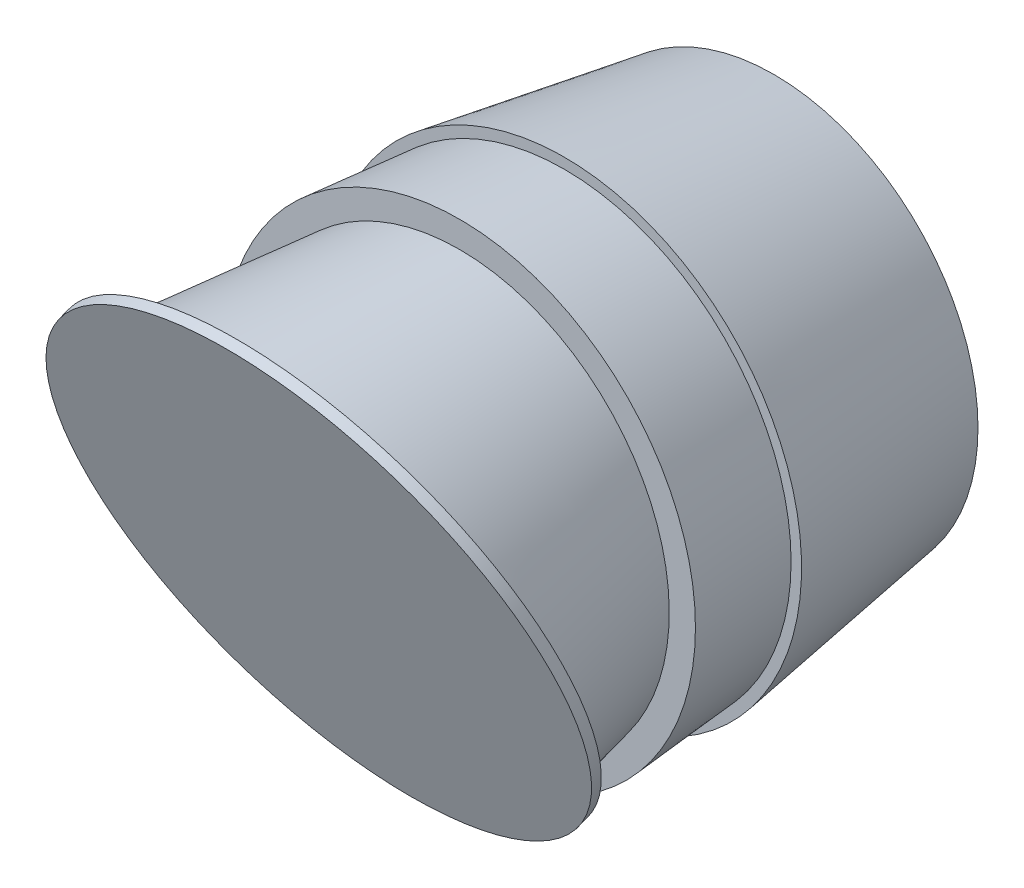
ISO-10303-21;
HEADER;
FILE_DESCRIPTION(('STEP AP214'),'2;1');
FILE_NAME('part.step','',(''),(''),'','','');
FILE_SCHEMA(('AUTOMOTIVE_DESIGN { 1 0 10303 214 1 1 1 1 }'));
ENDSEC;
DATA;
#1=APPLICATION_CONTEXT('core data for automotive mechanical design processes');
#2=APPLICATION_PROTOCOL_DEFINITION('international standard','automotive_design',2000,#1);
#3=PRODUCT_CONTEXT('',#1,'mechanical');
#4=PRODUCT('Part','Part','',(#3));
#5=PRODUCT_RELATED_PRODUCT_CATEGORY('part','',(#4));
#6=PRODUCT_DEFINITION_FORMATION('','',#4);
#7=PRODUCT_DEFINITION_CONTEXT('part definition',#1,'design');
#8=PRODUCT_DEFINITION('design','',#6,#7);
#9=PRODUCT_DEFINITION_SHAPE('','',#8);
#10=(LENGTH_UNIT() NAMED_UNIT(*) SI_UNIT(.MILLI.,.METRE.));
#11=(NAMED_UNIT(*) PLANE_ANGLE_UNIT() SI_UNIT($,.RADIAN.));
#12=(NAMED_UNIT(*) SI_UNIT($,.STERADIAN.) SOLID_ANGLE_UNIT());
#13=UNCERTAINTY_MEASURE_WITH_UNIT(LENGTH_MEASURE(1.E-05),#10,'distance_accuracy_value','');
#14=(GEOMETRIC_REPRESENTATION_CONTEXT(3) GLOBAL_UNCERTAINTY_ASSIGNED_CONTEXT((#13)) GLOBAL_UNIT_ASSIGNED_CONTEXT((#10,
#11,#12)) REPRESENTATION_CONTEXT('',''));
#15=CARTESIAN_POINT('',(0.,0.,0.));
#16=DIRECTION('',(0.,0.,1.));
#17=DIRECTION('',(1.,0.,0.));
#18=AXIS2_PLACEMENT_3D('',#15,#16,#17);
#19=CARTESIAN_POINT('',(-0.0205933860866078,10.5027622016416,10.7492532908594));
#20=CARTESIAN_POINT('',(0.0303157477264554,9.9999540476664,0.));
#21=CARTESIAN_POINT('',(0.448155828565419,10.5035632675652,10.7495607912571));
#22=CARTESIAN_POINT('',(0.446980499712556,9.99869089151114,0.));
#23=CARTESIAN_POINT('',(0.946546475494866,10.4772717269009,10.7394684143705));
#24=CARTESIAN_POINT('',(0.889867459422504,9.97150428109679,0.));
#25=CARTESIAN_POINT('',(1.99935189677114,10.3474672167512,10.6896411313386));
#26=CARTESIAN_POINT('',(1.82508253102633,9.84336504850924,0.));
#27=CARTESIAN_POINT('',(2.55391850895517,10.2438917756533,10.6498822445882));
#28=CARTESIAN_POINT('',(2.31754531908952,9.74235228979177,0.));
#29=CARTESIAN_POINT('',(3.70653163468178,9.9321779775114,10.5302265282572));
#30=CARTESIAN_POINT('',(3.34063518323846,9.44058266300093,0.));
#31=CARTESIAN_POINT('',(4.30473226689723,9.72386952332656,10.4502644045018));
#32=CARTESIAN_POINT('',(3.87139846464486,9.23966317636294,0.));
#33=CARTESIAN_POINT('',(5.51777995843688,9.17435011343284,10.2393236664898));
#34=CARTESIAN_POINT('',(4.94710642697551,8.71121344502989,0.));
#35=CARTESIAN_POINT('',(6.13269125192184,8.83283023429623,10.1082264676396));
#36=CARTESIAN_POINT('',(5.49210677414786,8.38338879128265,0.));
#37=CARTESIAN_POINT('',(7.33433671231795,7.99465998692925,9.78648305443865));
#38=CARTESIAN_POINT('',(6.55634327941416,7.58015878771185,0.));
#39=CARTESIAN_POINT('',(7.92090058127497,7.49760892545096,9.59568302836096));
#40=CARTESIAN_POINT('',(7.07542620839644,7.1043726667858,0.));
#41=CARTESIAN_POINT('',(9.00404409841044,6.34321279230011,9.15255187066038));
#42=CARTESIAN_POINT('',(8.03286498372746,6.00057057055756,0.));
#43=CARTESIAN_POINT('',(9.50011358647049,5.68556523886479,8.90010462716753));
#44=CARTESIAN_POINT('',(8.47076595948727,5.37226880187357,0.));
#45=CARTESIAN_POINT('',(10.3334123177691,4.23331491944336,8.34263795967295));
#46=CARTESIAN_POINT('',(9.20474424013718,3.98595427641283,0.));
#47=CARTESIAN_POINT('',(10.6699024674884,3.43879028767246,8.03764852858635));
#48=CARTESIAN_POINT('',(9.50016494248474,3.22801910685329,0.));
#49=CARTESIAN_POINT('',(11.1276150210186,1.76906838625703,7.39670234212201));
#50=CARTESIAN_POINT('',(9.89928604110318,1.63626928255889,0.));
#51=CARTESIAN_POINT('',(11.2482650361414,0.894455765635889,7.06097001247748));
#52=CARTESIAN_POINT('',(10.002480359977,0.803013756245744,0.));
#53=CARTESIAN_POINT('',(11.2516972671558,-0.856004601304376,6.38903123285421));
#54=CARTESIAN_POINT('',(9.99742773535587,-0.863645251698658,0.));
#55=CARTESIAN_POINT('',(11.1344778583227,-1.73102372733146,6.05314286040429));
#56=CARTESIAN_POINT('',(9.88918318363599,-1.69625978232023,0.));
#57=CARTESIAN_POINT('',(10.6833161949465,-3.40229884343232,5.41160045068353));
#58=CARTESIAN_POINT('',(9.48041844834433,-3.28556042904683,0.));
#59=CARTESIAN_POINT('',(10.3499440325514,-4.19796823204749,5.10617158861555));
#60=CARTESIAN_POINT('',(9.18040772293117,-4.04169049541626,0.));
#61=CARTESIAN_POINT('',(9.52234589255707,-5.65305693038152,4.54761536953862));
#62=CARTESIAN_POINT('',(8.43803753979643,-5.42352933955175,0.));
#63=CARTESIAN_POINT('',(9.02885869712017,-6.31239558027911,4.29451897493412));
#64=CARTESIAN_POINT('',(7.99633514296919,-6.04916451258785,0.));
#65=CARTESIAN_POINT('',(7.95024940898482,-7.47048602683542,3.84996970318305));
#66=CARTESIAN_POINT('',(7.03222147979197,-7.14714125215031,0.));
#67=CARTESIAN_POINT('',(7.3656386591696,-7.96953855956599,3.65840138427445));
#68=CARTESIAN_POINT('',(6.51026334286995,-7.61977136474109,0.));
#69=CARTESIAN_POINT('',(6.16728814054734,-8.81181026446167,3.33508356903704));
#70=CARTESIAN_POINT('',(5.44117631796741,-8.41653400879692,0.));
#71=CARTESIAN_POINT('',(5.55372023987373,-9.15542954513219,3.20318048544288));
#72=CARTESIAN_POINT('',(4.89419834762056,-8.74104823341229,0.));
#73=CARTESIAN_POINT('',(4.34283562082797,-9.70909131839285,2.99064964311418));
#74=CARTESIAN_POINT('',(3.81530610273614,-9.26296610309658,0.));
#75=CARTESIAN_POINT('',(3.74545588017028,-9.91944295188481,2.90990321630567));
#76=CARTESIAN_POINT('',(3.28333437793577,-9.46066381429494,0.));
#77=CARTESIAN_POINT('',(2.59407286603925,-10.2350941492543,2.78873607401967));
#78=CARTESIAN_POINT('',(2.25843365312263,-9.75622477595138,0.));
#79=CARTESIAN_POINT('',(2.03991614196265,-10.3405643358911,2.74824986260131));
#80=CARTESIAN_POINT('',(1.76536746431665,-9.85424981615561,0.));
#81=CARTESIAN_POINT('',(0.987626805230796,-10.4739663340447,2.69704163330828));
#82=CARTESIAN_POINT('',(0.829392659039681,-9.9767163706503,0.));
#83=CARTESIAN_POINT('',(0.489342600738635,-10.501961135718,2.68629543577794));
#84=CARTESIAN_POINT('',(0.386349004259644,-10.0012172038217,0.));
#85=CARTESIAN_POINT('',(-0.448155828565417,-10.5035632675652,2.68568043498244));
#86=CARTESIAN_POINT('',(-0.446980499712557,-9.99869089151114,0.));
#87=CARTESIAN_POINT('',(-0.946546475494865,-10.4772717269009,2.69577281186911));
#88=CARTESIAN_POINT('',(-0.889867459422507,-9.9715042810968,0.));
#89=CARTESIAN_POINT('',(-1.99935189677114,-10.3474672167512,2.74560009490098));
#90=CARTESIAN_POINT('',(-1.82508253102633,-9.84336504850924,0.));
#91=CARTESIAN_POINT('',(-2.55391850895517,-10.2438917756533,2.78535898165139));
#92=CARTESIAN_POINT('',(-2.31754531908952,-9.74235228979177,0.));
#93=CARTESIAN_POINT('',(-3.70653163468178,-9.9321779775114,2.90501469798237));
#94=CARTESIAN_POINT('',(-3.34063518323847,-9.44058266300094,0.));
#95=CARTESIAN_POINT('',(-4.30473226689723,-9.72386952332656,2.98497682173775));
#96=CARTESIAN_POINT('',(-3.87139846464486,-9.23966317636294,0.));
#97=CARTESIAN_POINT('',(-5.51777995843688,-9.17435011343284,3.19591755974983));
#98=CARTESIAN_POINT('',(-4.94710642697552,-8.71121344502989,0.));
#99=CARTESIAN_POINT('',(-6.13269125192183,-8.83283023429623,3.32701475860002));
#100=CARTESIAN_POINT('',(-5.49210677414786,-8.38338879128265,0.));
#101=CARTESIAN_POINT('',(-7.33433671231795,-7.99465998692925,3.64875817180094));
#102=CARTESIAN_POINT('',(-6.55634327941416,-7.58015878771185,0.));
#103=CARTESIAN_POINT('',(-7.92090058127497,-7.49760892545096,3.83955819787863));
#104=CARTESIAN_POINT('',(-7.07542620839644,-7.1043726667858,0.));
#105=CARTESIAN_POINT('',(-9.00404409841044,-6.34321279230011,4.2826893555792));
#106=CARTESIAN_POINT('',(-8.03286498372746,-6.00057057055756,0.));
#107=CARTESIAN_POINT('',(-9.50011358647049,-5.68556523886479,4.53513659907205));
#108=CARTESIAN_POINT('',(-8.47076595948727,-5.37226880187357,0.));
#109=CARTESIAN_POINT('',(-10.3334123177691,-4.23331491944336,5.09260326656664));
#110=CARTESIAN_POINT('',(-9.20474424013718,-3.98595427641283,0.));
#111=CARTESIAN_POINT('',(-10.6699024674884,-3.43879028767247,5.39759269765324));
#112=CARTESIAN_POINT('',(-9.50016494248474,-3.22801910685329,0.));
#113=CARTESIAN_POINT('',(-11.1276150210186,-1.76906838625703,6.03853888411758));
#114=CARTESIAN_POINT('',(-9.89928604110318,-1.63626928255889,0.));
#115=CARTESIAN_POINT('',(-11.2482650361414,-0.894455765635897,6.37427121376211));
#116=CARTESIAN_POINT('',(-10.002480359977,-0.803013756245742,0.));
#117=CARTESIAN_POINT('',(-11.2516972671559,0.856004601304372,7.04620999338537));
#118=CARTESIAN_POINT('',(-9.99742773535587,0.863645251698656,0.));
#119=CARTESIAN_POINT('',(-11.1344778583227,1.73102372733146,7.38209836583529));
#120=CARTESIAN_POINT('',(-9.889183183636,1.69625978232023,0.));
#121=CARTESIAN_POINT('',(-10.6833161949465,3.40229884343231,8.02364077555606));
#122=CARTESIAN_POINT('',(-9.48041844834433,3.28556042904682,0.));
#123=CARTESIAN_POINT('',(-10.3499440325514,4.19796823204748,8.32906963762404));
#124=CARTESIAN_POINT('',(-9.18040772293116,4.04169049541626,0.));
#125=CARTESIAN_POINT('',(-9.52234589255708,5.65305693038151,8.88762585670097));
#126=CARTESIAN_POINT('',(-8.43803753979642,5.42352933955176,0.));
#127=CARTESIAN_POINT('',(-9.02885869712018,6.3123955802791,9.14072225130546));
#128=CARTESIAN_POINT('',(-7.99633514296919,6.04916451258785,0.));
#129=CARTESIAN_POINT('',(-7.95024940898482,7.47048602683542,9.58527152305654));
#130=CARTESIAN_POINT('',(-7.03222147979197,7.14714125215031,0.));
#131=CARTESIAN_POINT('',(-7.3656386591696,7.96953855956599,9.77683984196513));
#132=CARTESIAN_POINT('',(-6.51026334286995,7.61977136474109,0.));
#133=CARTESIAN_POINT('',(-6.16728814054734,8.81181026446167,10.1001576572026));
#134=CARTESIAN_POINT('',(-5.44117631796742,8.41653400879691,0.));
#135=CARTESIAN_POINT('',(-5.55372023987373,9.15542954513218,10.2320607407967));
#136=CARTESIAN_POINT('',(-4.89419834762057,8.74104823341228,0.));
#137=CARTESIAN_POINT('',(-4.34283562082797,9.70909131839284,10.4445915831254));
#138=CARTESIAN_POINT('',(-3.81530610273614,9.26296610309658,0.));
#139=CARTESIAN_POINT('',(-3.74545588017029,9.9194429518848,10.5253380099339));
#140=CARTESIAN_POINT('',(-3.28333437793576,9.46066381429493,0.));
#141=CARTESIAN_POINT('',(-2.59407286603925,10.2350941492543,10.6465051522199));
#142=CARTESIAN_POINT('',(-2.25843365312263,9.75622477595138,0.));
#143=CARTESIAN_POINT('',(-2.03991614196266,10.3405643358911,10.6869913636383));
#144=CARTESIAN_POINT('',(-1.76536746431666,9.85424981615561,0.));
#145=CARTESIAN_POINT('',(-0.987626805230805,10.4739663340447,10.7381995929313));
#146=CARTESIAN_POINT('',(-0.829392659039681,9.9767163706503,0.));
#147=CARTESIAN_POINT('',(-0.489342600738635,10.501961135718,10.7489457904616));
#148=CARTESIAN_POINT('',(-0.386349004259645,10.0012172038217,0.));
#149=CARTESIAN_POINT('',(-0.0205933860866078,10.5027622016416,10.7492532908594));
#150=CARTESIAN_POINT('',(0.0303157477264554,9.9999540476664,0.));
#151=B_SPLINE_SURFACE_WITH_KNOTS('',3,1,((#19,#20),(#21,#22),(#23,#24),(#25,#26),(#27,#28),(#29,
#30),(#31,#32),(#33,#34),(#35,#36),(#37,#38),(#39,#40),(#41,#42),(#43,#44),(#45,#46),(#47,#48),
(#49,#50),(#51,#52),(#53,#54),(#55,#56),(#57,#58),(#59,#60),(#61,#62),(#63,#64),(#65,#66),(#67,
#68),(#69,#70),(#71,#72),(#73,#74),(#75,#76),(#77,#78),(#79,#80),(#81,#82),(#83,#84),(#85,#86),
(#87,#88),(#89,#90),(#91,#92),(#93,#94),(#95,#96),(#97,#98),(#99,#100),(#101,#102),(#103,#104),
(#105,#106),(#107,#108),(#109,#110),(#111,#112),(#113,#114),(#115,#116),(#117,#118),(#119,#120),
(#121,#122),(#123,#124),(#125,#126),(#127,#128),(#129,#130),(#131,#132),(#133,#134),(#135,#136),
(#137,#138),(#139,#140),(#141,#142),(#143,#144),(#145,#146),(#147,#148),(#149,#150)),
.UNSPECIFIED.,.T.,.F.,.F.,(4,2,2,2,2,2,2,2,2,2,2,2,2,2,2,2,2,2,2,2,2,2,2,2,2,2,2,2,2,2,2,2,4),
(2,2),(0.,0.03125,0.0625,0.09375,0.125,0.15625,0.1875,0.21875,0.25,0.28125,0.3125,0.34375,0.375,
0.40625,0.4375,0.46875,0.5,0.53125,0.5625,0.59375,0.625,0.65625,0.6875,0.71875,0.75,0.78125,
0.8125,0.84375,0.875,0.90625,0.9375,0.96875,1.),(0.,1.),.UNSPECIFIED.);
#152=CARTESIAN_POINT('',(0.,0.,0.));
#153=DIRECTION('',(0.,0.,1.));
#154=DIRECTION('',(1.,0.,0.));
#155=AXIS2_PLACEMENT_3D('',#152,#153,#154);
#156=CIRCLE('',#155,10.);
#157=CARTESIAN_POINT('',(0.0303157477264554,9.9999540476664,0.));
#158=VERTEX_POINT('',#157);
#159=EDGE_CURVE('E77',#158,#158,#156,.T.);
#160=CARTESIAN_POINT('',(-0.0180105039882884,10.4772521588945,10.203888406098));
#161=CARTESIAN_POINT('',(0.138498821080439,10.4774858474269,10.203978110721));
#162=CARTESIAN_POINT('',(0.295008139116651,10.4746601414655,10.2028934238289));
#163=CARTESIAN_POINT('',(0.607762428875974,10.4628373291221,10.1983550713773));
#164=CARTESIAN_POINT('',(0.764007400122251,10.4538402116198,10.1949014015491));
#165=CARTESIAN_POINT('',(1.07597287223414,10.4296825642984,10.1856281495714));
#166=CARTESIAN_POINT('',(1.23169329692065,10.4145211751305,10.1798082375487));
#167=CARTESIAN_POINT('',(1.54234423437188,10.3781202406176,10.1658352279475));
#168=CARTESIAN_POINT('',(1.69727454911716,10.3568792411024,10.1576815721654));
#169=CARTESIAN_POINT('',(2.16069945275503,10.283968683417,10.1296938312956));
#170=CARTESIAN_POINT('',(2.46760014182694,10.223129158108,10.1063397256208));
#171=CARTESIAN_POINT('',(3.07477908413944,10.0775407207837,10.050453560615));
#172=CARTESIAN_POINT('',(3.3750573142159,9.992791725152,10.0179214691866));
#173=CARTESIAN_POINT('',(3.96675912704982,9.8000050223067,9.94391758753128));
#174=CARTESIAN_POINT('',(4.25818694886002,9.69197867148971,9.90245015661652));
#175=CARTESIAN_POINT('',(4.83025746429556,9.45338477610769,9.81086254120035));
#176=CARTESIAN_POINT('',(5.11089999327115,9.32281688758745,9.76074222466692));
#177=CARTESIAN_POINT('',(5.65934461492688,9.04012699815619,9.65222774304612));
#178=CARTESIAN_POINT('',(5.92715002286956,8.88801060285182,9.59383572974954));
#179=CARTESIAN_POINT('',(6.44809220294886,8.56326316935705,9.46917686956085));
#180=CARTESIAN_POINT('',(6.70122901639584,8.39063218894495,9.40291004484774));
#181=CARTESIAN_POINT('',(7.19100463438143,8.02607196131401,9.26296848485589));
#182=CARTESIAN_POINT('',(7.42764341804996,7.83414268968351,9.1892937402064));
#183=CARTESIAN_POINT('',(7.88287387813715,7.43240454448057,9.03508091476116));
#184=CARTESIAN_POINT('',(8.10146555910747,7.22259567541758,8.95454283569642));
#185=CARTESIAN_POINT('',(8.41449530485853,6.89557107777345,8.82900985408891));
#186=CARTESIAN_POINT('',(8.5163754565562,6.78449461244723,8.78637159391132));
#187=CARTESIAN_POINT('',(8.71501314277107,6.55841945503728,8.69958947176667));
#188=CARTESIAN_POINT('',(8.81177067659787,6.44342076242495,8.6554456095967));
#189=CARTESIAN_POINT('',(9.09415911989164,6.09290626031166,8.52089569847706));
#190=CARTESIAN_POINT('',(9.27195288015771,5.85182284665882,8.42835244653217));
#191=CARTESIAN_POINT('',(9.60559343863625,5.35610877584633,8.23806564308626));
#192=CARTESIAN_POINT('',(9.76139454834891,5.10145138765681,8.14031183050424));
#193=CARTESIAN_POINT('',(10.049248121844,4.58068141878866,7.94040696892925));
#194=CARTESIAN_POINT('',(10.1813003277015,4.31456871373843,7.83825587219448));
#195=CARTESIAN_POINT('',(10.4211355280031,3.77300202579611,7.63036789812017));
#196=CARTESIAN_POINT('',(10.5289187983333,3.49754814913417,7.52463106155857));
#197=CARTESIAN_POINT('',(10.7193137549637,2.93912195970765,7.31027133121586));
#198=CARTESIAN_POINT('',(10.8019266133378,2.65614999769413,7.20164857207546));
#199=CARTESIAN_POINT('',(10.9062401665808,2.2276959721158,7.03718048098979));
#200=CARTESIAN_POINT('',(10.9377396705311,2.0842391458378,6.98211256480134));
#201=CARTESIAN_POINT('',(10.9942691820685,1.79625809239779,6.87156699561411));
#202=CARTESIAN_POINT('',(11.0193006877237,1.65173412039051,6.81608944056005));
#203=CARTESIAN_POINT('',(11.0846787496887,1.21684450873282,6.64915095943415));
#204=CARTESIAN_POINT('',(11.1153158702829,0.925132246654723,6.53717311344354));
#205=CARTESIAN_POINT('',(11.1415765524401,0.486639654234606,6.36885157758401));
#206=CARTESIAN_POINT('',(11.1470470120586,0.340301281152536,6.31267753921221));
#207=CARTESIAN_POINT('',(11.1513233479283,0.0475377230279461,6.20029613847918));
#208=CARTESIAN_POINT('',(11.1501293771122,-0.0988874599453967,6.14408877691223));
#209=CARTESIAN_POINT('',(11.136596234734,-0.537879807212552,5.97557540314059));
#210=CARTESIAN_POINT('',(11.1143093863973,-0.8302232676702,5.86335526279311));
#211=CARTESIAN_POINT('',(11.0436593108689,-1.41325451047176,5.63955053737958));
#212=CARTESIAN_POINT('',(10.9951989233503,-1.70393201934234,5.52796989593048));
#213=CARTESIAN_POINT('',(10.9030634259761,-2.13627555789632,5.36200876069966));
#214=CARTESIAN_POINT('',(10.8691060467422,-2.27979328242781,5.3069174678619));
#215=CARTESIAN_POINT('',(10.7946734425516,-2.56534788069489,5.19730332754818));
#216=CARTESIAN_POINT('',(10.7541982424494,-2.70738476007524,5.1427804779054));
#217=CARTESIAN_POINT('',(10.6231846265087,-3.13088704694,4.98021318122277));
#218=CARTESIAN_POINT('',(10.523043946614,-3.40981083888199,4.87314436898054));
#219=CARTESIAN_POINT('',(10.2982115516755,-3.95889685614801,4.66236999481128));
#220=CARTESIAN_POINT('',(10.1735195622312,-4.22905898350704,4.55866447048949));
#221=CARTESIAN_POINT('',(9.96838667885895,-4.62666203162298,4.40603896009732));
#222=CARTESIAN_POINT('',(9.89684641693589,-4.75815538078952,4.35556339250593));
#223=CARTESIAN_POINT('',(9.74783022542804,-5.01817596126914,4.25575084329078));
#224=CARTESIAN_POINT('',(9.67035430395672,-5.1467031966363,4.20641386011079));
#225=CARTESIAN_POINT('',(9.42932422282244,-5.52752257346122,4.0602309975031));
#226=CARTESIAN_POINT('',(9.25713698642894,-5.77511191908504,3.96519035226017));
#227=CARTESIAN_POINT('',(8.89118710851002,-6.2559485790853,3.78061445175951));
#228=CARTESIAN_POINT('',(8.69742375175859,-6.48919541762444,3.69107937915862));
#229=CARTESIAN_POINT('',(8.28942655815743,-6.9395411752021,3.51820783949378));
#230=CARTESIAN_POINT('',(8.07519279272012,-7.15664015056884,3.43487135080745));
#231=CARTESIAN_POINT('',(7.62820107822216,-7.57298114578557,3.2750530164329));
#232=CARTESIAN_POINT('',(7.39546620857001,-7.77224477446102,3.19856287589374));
#233=CARTESIAN_POINT('',(6.91274087609337,-8.15185725792551,3.05284329624124));
#234=CARTESIAN_POINT('',(6.66274282815914,-8.33219770941833,2.9836170828511));
#235=CARTESIAN_POINT('',(6.14730715554001,-8.67249699831919,2.85298842469393));
#236=CARTESIAN_POINT('',(5.88186952506682,-8.83245582808611,2.79158598286006));
#237=CARTESIAN_POINT('',(5.33757156752422,-9.13077084926624,2.67707357511818));
#238=CARTESIAN_POINT('',(5.05871736502375,-9.26913677754336,2.62395987157829));
#239=CARTESIAN_POINT('',(4.48991574538947,-9.52310086532807,2.52647219208717));
#240=CARTESIAN_POINT('',(4.19998686209194,-9.63873523095091,2.48208431791043));
#241=CARTESIAN_POINT('',(3.61059484732394,-9.84655560583075,2.40230955024649));
#242=CARTESIAN_POINT('',(3.31113172289094,-9.93874163239512,2.3669226501156));
#243=CARTESIAN_POINT('',(2.85655297232498,-10.0589490703958,2.3207793379234));
#244=CARTESIAN_POINT('',(2.704115018574,-10.096008876465,2.30655341122805));
#245=CARTESIAN_POINT('',(2.3976788745231,-10.1640065976716,2.28045153159248));
#246=CARTESIAN_POINT('',(2.24368078576145,-10.1949449085576,2.26857542673857));
#247=CARTESIAN_POINT('',(1.93441966690818,-10.2506246342462,2.24720198256611));
#248=CARTESIAN_POINT('',(1.77915673175878,-10.2753665098214,2.23770446637345));
#249=CARTESIAN_POINT('',(1.46761264073683,-10.31865568187,2.22108731011753));
#250=CARTESIAN_POINT('',(1.31133129331607,-10.3372017765908,2.21396813136386));
#251=CARTESIAN_POINT('',(0.999739009808869,-10.3678681003654,2.20219643258002));
#252=CARTESIAN_POINT('',(0.84443565470118,-10.380055144622,2.19751826459656));
#253=CARTESIAN_POINT('',(0.533416414965429,-10.3982380693866,2.19053849372767));
#254=CARTESIAN_POINT('',(0.377700507646601,-10.4042336019579,2.18823702440267));
#255=CARTESIAN_POINT('',(-0.0897439600713208,-10.4129998504746,2.18487197687492));
#256=CARTESIAN_POINT('',(-0.401734298472371,-10.4065467942693,2.18734907306817));
#257=CARTESIAN_POINT('',(-1.02387979201364,-10.3689072095875,2.20179755592118));
#258=CARTESIAN_POINT('',(-1.33403530662821,-10.3377256992164,2.21376701631076));
#259=CARTESIAN_POINT('',(-1.95046781275299,-10.2510363006247,2.24704395864893));
#260=CARTESIAN_POINT('',(-2.25674486268388,-10.1955287792726,2.26835129976998));
#261=CARTESIAN_POINT('',(-2.71064870883562,-10.0944519854769,2.30715104568484));
#262=CARTESIAN_POINT('',(-2.86064250017011,-10.0579102367178,2.32117810881076));
#263=CARTESIAN_POINT('',(-3.15882720660667,-9.97902294624361,2.3514601024452));
#264=CARTESIAN_POINT('',(-3.30701857230553,-9.93667888895183,2.36771446313699));
#265=CARTESIAN_POINT('',(-3.74843840779088,-9.80103006386232,2.41978516848366));
#266=CARTESIAN_POINT('',(-4.03867470538138,-9.69907253190317,2.45892299810375));
#267=CARTESIAN_POINT('',(-4.60910805462394,-9.47286290752709,2.5457567372806));
#268=CARTESIAN_POINT('',(-4.88930055651547,-9.34860086070327,2.59345646797615));
#269=CARTESIAN_POINT('',(-5.43755498366742,-9.07879909340163,2.69702366303225));
#270=CARTESIAN_POINT('',(-5.70562115655891,-8.93326690023612,2.75288823792831));
#271=CARTESIAN_POINT('',(-6.23042271023627,-8.6204395143078,2.87297142056034));
#272=CARTESIAN_POINT('',(-6.48702370299389,-8.45294776573602,2.93726547900224));
#273=CARTESIAN_POINT('',(-6.98427998830222,-8.09848662029503,3.07333036455449));
#274=CARTESIAN_POINT('',(-7.22493521648928,-7.91151714481356,3.14510122184127));
#275=CARTESIAN_POINT('',(-7.68876794589425,-7.51949389975246,3.2955848465181));
#276=CARTESIAN_POINT('',(-7.91194511655201,-7.31443978829642,3.37429774514221));
#277=CARTESIAN_POINT('',(-8.2323216111417,-6.99439884841477,3.49714995170171));
#278=CARTESIAN_POINT('',(-8.33672650833059,-6.8856289605404,3.53890279975152));
#279=CARTESIAN_POINT('',(-8.54054665973089,-6.66408740572788,3.62394463490988));
#280=CARTESIAN_POINT('',(-8.63996188644686,-6.55131571674375,3.66723363048108));
#281=CARTESIAN_POINT('',(-8.93199671534373,-6.20560850188567,3.79993819691736));
#282=CARTESIAN_POINT('',(-9.1168191697678,-5.96686640318688,3.8915827022567));
#283=CARTESIAN_POINT('',(-9.46442145243012,-5.47581973929956,4.08007785604717));
#284=CARTESIAN_POINT('',(-9.62720130593442,-5.22351518965728,4.17692849853065));
#285=CARTESIAN_POINT('',(-9.92925456775345,-4.70690450930492,4.3752367588331));
#286=CARTESIAN_POINT('',(-10.0685272645421,-4.44259801562129,4.47669451598455));
#287=CARTESIAN_POINT('',(-10.3229025669342,-3.90404855872501,4.68342428357489));
#288=CARTESIAN_POINT('',(-10.4380051094576,-3.62980556958192,4.78869630396753));
#289=CARTESIAN_POINT('',(-10.6435698389686,-3.07229557618854,5.00270433960409));
#290=CARTESIAN_POINT('',(-10.7339443308616,-2.78900033512204,5.1114511939462));
#291=CARTESIAN_POINT('',(-10.8884133837324,-2.21623148134376,5.33131655730014));
#292=CARTESIAN_POINT('',(-10.952507631223,-1.92675779497496,5.44243509458625));
#293=CARTESIAN_POINT('',(-11.054486730356,-1.34383660960276,5.66619757291085));
#294=CARTESIAN_POINT('',(-11.0923725330295,-1.05038925518667,5.77884145844748));
#295=CARTESIAN_POINT('',(-11.1415037782298,-0.461544561241077,6.00487775867463));
#296=CARTESIAN_POINT('',(-11.1527497562607,-0.166147261028367,6.11827015827285));
#297=CARTESIAN_POINT('',(-11.148105921557,0.42305010932267,6.34444183828805));
#298=CARTESIAN_POINT('',(-11.1323440652284,0.716851131847205,6.45722148429185));
#299=CARTESIAN_POINT('',(-11.0745790828579,1.30222848678551,6.68192679777683));
#300=CARTESIAN_POINT('',(-11.0325757064457,1.59380479794645,6.79385245709981));
#301=CARTESIAN_POINT('',(-10.9500289647076,2.02786588810344,6.96047289861935));
#302=CARTESIAN_POINT('',(-10.9192512553248,2.17202056672162,7.01580869522295));
#303=CARTESIAN_POINT('',(-10.8511437278117,2.45897494938248,7.12596016242225));
#304=CARTESIAN_POINT('',(-10.8138139594701,2.6017746637128,7.18077583696699));
#305=CARTESIAN_POINT('',(-10.6921091970058,3.02773397915122,7.3442862985521));
#306=CARTESIAN_POINT('',(-10.5980063439201,3.30851899026228,7.45206956589466));
#307=CARTESIAN_POINT('',(-10.3850337024235,3.86146499225433,7.66432564937603));
#308=CARTESIAN_POINT('',(-10.266188104723,4.13363410957796,7.7688015849639));
#309=CARTESIAN_POINT('',(-10.0698661508924,4.53410926611072,7.92252959448201));
#310=CARTESIAN_POINT('',(-10.0014079756509,4.66631880257045,7.9732800806176));
#311=CARTESIAN_POINT('',(-9.85851054002548,4.92788901610067,8.07368747822839));
#312=CARTESIAN_POINT('',(-9.7840712942972,5.05724970015083,8.12334439238283));
#313=CARTESIAN_POINT('',(-9.5520605554508,5.44070828528047,8.27054035213966));
#314=CARTESIAN_POINT('',(-9.38575781337345,5.69026067100742,8.36633453787753));
#315=CARTESIAN_POINT('',(-9.03133681526215,6.17543274753699,8.55257464886068));
#316=CARTESIAN_POINT('',(-8.84321848515862,6.41105239103024,8.6430205559456));
#317=CARTESIAN_POINT('',(-8.446458165398,6.86631250187726,8.81777853908601));
#318=CARTESIAN_POINT('',(-8.23783853508477,7.08596993296997,8.90209712691077));
#319=CARTESIAN_POINT('',(-7.80149204893468,7.5080598587904,9.06412226898401));
#320=CARTESIAN_POINT('',(-7.57376514841437,7.71049231323429,9.14182880776896));
#321=CARTESIAN_POINT('',(-7.10078863981795,8.09677947342984,9.290110555764));
#322=CARTESIAN_POINT('',(-6.8555344248971,8.28062926406706,9.36068387823841));
#323=CARTESIAN_POINT('',(-6.34924397167351,8.6282901806853,9.4941384005156));
#324=CARTESIAN_POINT('',(-6.08820802843786,8.79210168114429,9.557019744067));
#325=CARTESIAN_POINT('',(-5.55294339883683,9.09817023421658,9.67450845384678));
#326=CARTESIAN_POINT('',(-5.27875022293658,9.240481430183,9.72913660376116));
#327=CARTESIAN_POINT('',(-4.71836165520515,9.50310837868557,9.8299496439224));
#328=CARTESIAN_POINT('',(-4.43216053642169,9.623413485823,9.87613044778354));
#329=CARTESIAN_POINT('',(-3.85030882397042,9.84086610242528,9.9596026866215));
#330=CARTESIAN_POINT('',(-3.55467189484466,9.93804551682882,9.99690636875682));
#331=CARTESIAN_POINT('',(-2.95571246617832,10.1088710514142,10.0624801477498));
#332=CARTESIAN_POINT('',(-2.65239114002374,10.1825207414205,10.0907516149348));
#333=CARTESIAN_POINT('',(-2.15518693478022,10.282508528785,10.1291333304468));
#334=CARTESIAN_POINT('',(-1.96297024435272,10.3162280488009,10.1420770414596));
#335=CARTESIAN_POINT('',(-1.57693717977623,10.3741956713394,10.1643287269486));
#336=CARTESIAN_POINT('',(-1.38312116910467,10.3984458685377,10.1736375054955));
#337=CARTESIAN_POINT('',(-0.994393390914858,10.4374057674836,10.1885928095094));
#338=CARTESIAN_POINT('',(-0.799481614670437,10.4521153931457,10.19423930577));
#339=CARTESIAN_POINT('',(-0.409050140167761,10.4718936909474,10.2018314829703));
#340=CARTESIAN_POINT('',(-0.213530316590432,10.4769602226916,10.2037763422892));
#341=CARTESIAN_POINT('',(-0.0180105039882884,10.4772521588945,10.203888406098));
#342=B_SPLINE_CURVE_WITH_KNOTS('',3,(#160,#161,#162,#163,#164,#165,#166,#167,#168,#169,#170,
#171,#172,#173,#174,#175,#176,#177,#178,#179,#180,#181,#182,#183,#184,#185,#186,#187,#188,#189,
#190,#191,#192,#193,#194,#195,#196,#197,#198,#199,#200,#201,#202,#203,#204,#205,#206,#207,#208,
#209,#210,#211,#212,#213,#214,#215,#216,#217,#218,#219,#220,#221,#222,#223,#224,#225,#226,#227,
#228,#229,#230,#231,#232,#233,#234,#235,#236,#237,#238,#239,#240,#241,#242,#243,#244,#245,#246,
#247,#248,#249,#250,#251,#252,#253,#254,#255,#256,#257,#258,#259,#260,#261,#262,#263,#264,#265,
#266,#267,#268,#269,#270,#271,#272,#273,#274,#275,#276,#277,#278,#279,#280,#281,#282,#283,#284,
#285,#286,#287,#288,#289,#290,#291,#292,#293,#294,#295,#296,#297,#298,#299,#300,#301,#302,#303,
#304,#305,#306,#307,#308,#309,#310,#311,#312,#313,#314,#315,#316,#317,#318,#319,#320,#321,#322,
#323,#324,#325,#326,#327,#328,#329,#330,#331,#332,#333,#334,#335,#336,#337,#338,#339,#340,#341),
.UNSPECIFIED.,.T.,.F.,(4,2,2,2,2,2,2,2,2,2,2,2,2,2,2,2,2,2,2,2,2,2,2,2,2,2,2,2,2,2,2,2,2,2,2,2,
2,2,2,2,2,2,2,2,2,2,2,2,2,2,2,2,2,2,2,2,2,2,2,2,2,2,2,2,2,2,2,2,2,2,2,2,2,2,2,2,2,2,2,2,2,2,2,2,
2,2,2,2,2,2,4),(0.,0.469484010752958,0.938968867471538,1.40851919659203,1.8781819305326,
2.81819111735105,3.75820359162389,4.69775849322556,5.63732773250741,6.57665300052366,
7.51597562304002,8.45529943378158,9.39462300761548,9.86441612088022,10.3342092974603,
11.2735845141068,12.2148833806491,13.1561924695535,14.0974908572425,15.0387454061585,
15.5091967890702,15.9795391117767,16.9201287315425,17.3905526520099,17.8609657774246,
18.8016011741861,19.7457526017685,20.2179305234896,20.6901066446834,21.6342409378929,
22.5783857839209,23.0521863265684,23.5259862215883,24.4733742988969,25.420793790492,
26.3682099770705,27.3144623063939,28.2611330793539,29.2078042072229,30.154047212467,
31.0987706380438,32.0434933663119,32.5159422022485,32.9883604848436,33.4607436275307,
33.9332183419681,34.4006233298445,34.8680545824775,35.8030222314119,36.7378001973998,
37.6725640661894,38.1374970154332,38.6023112406847,39.5314413573964,40.4609871765072,
41.3902048307316,42.328394101853,43.2665871596607,44.2047979571048,44.6740090055498,
45.143222639287,46.0885996908023,47.0339756586823,47.9793802365359,48.9247872817088,
49.8735048804798,50.8222337958194,51.7709282826355,52.7196036989789,53.6637969444931,
54.6079991986892,55.0802210381795,55.5524392894315,56.4966635908992,57.4399690337382,
57.9117264540246,58.3834827183812,59.3267206260468,60.2699617363434,61.2121853012932,
62.1544110697486,63.0968854083037,64.0393421310946,64.979384457612,65.9198803318851,
66.8590710465194,67.7981192036014,68.3846187162079,68.9709884177203,69.557362795437,
70.143867310499),.UNSPECIFIED.);
#343=CARTESIAN_POINT('',(-0.0180105039882884,10.4772521588945,10.203888406098));
#344=VERTEX_POINT('',#343);
#345=EDGE_CURVE('E55',#344,#344,#342,.T.);
#346=CARTESIAN_POINT('',(0.0303157477264554,9.9999540476664,0.));
#347=CARTESIAN_POINT('',(0.0298123492710934,10.0049259029917,0.106290504230188));
#348=CARTESIAN_POINT('',(0.0293089508157315,10.009897758317,0.212581008460376));
#349=CARTESIAN_POINT('',(0.0283021539050077,10.0198414689676,0.425162016920751));
#350=CARTESIAN_POINT('',(0.0277987554496458,10.0248133242929,0.531452521150939));
#351=CARTESIAN_POINT('',(0.026791958538922,10.0347570349435,0.744033529611315));
#352=CARTESIAN_POINT('',(0.0262885600835601,10.0397288902687,0.850324033841503));
#353=CARTESIAN_POINT('',(0.0252817631728362,10.0496726009193,1.06290504230188));
#354=CARTESIAN_POINT('',(0.0247783647174743,10.0546444562446,1.16919554653207));
#355=CARTESIAN_POINT('',(0.0237715678067505,10.0645881668952,1.38177655499244));
#356=CARTESIAN_POINT('',(0.0232681693513886,10.0695600222205,1.48806705922263));
#357=CARTESIAN_POINT('',(0.0222613724406648,10.0795037328711,1.70064806768301));
#358=CARTESIAN_POINT('',(0.0217579739853028,10.0844755881964,1.80693857191319));
#359=CARTESIAN_POINT('',(0.020751177074579,10.094419298847,2.01951958037357));
#360=CARTESIAN_POINT('',(0.0202477786192171,10.0993911541723,2.12581008460376));
#361=CARTESIAN_POINT('',(0.0192409817084933,10.1093348648228,2.33839109306413));
#362=CARTESIAN_POINT('',(0.0187375832531313,10.1143067201481,2.44468159729432));
#363=CARTESIAN_POINT('',(0.0177307863424075,10.1242504307987,2.6572626057547));
#364=CARTESIAN_POINT('',(0.0172273878870456,10.129222286124,2.76355310998488));
#365=CARTESIAN_POINT('',(0.0162205909763218,10.1391659967746,2.97613411844526));
#366=CARTESIAN_POINT('',(0.0157171925209599,10.1441378520999,3.08242462267545));
#367=CARTESIAN_POINT('',(0.0147103956102361,10.1540815627505,3.29500563113582));
#368=CARTESIAN_POINT('',(0.0142069971548741,10.1590534180758,3.40129613536601));
#369=CARTESIAN_POINT('',(0.0132002002441503,10.1689971287263,3.61387714382639));
#370=CARTESIAN_POINT('',(0.0126968017887884,10.1739689840516,3.72016764805658));
#371=CARTESIAN_POINT('',(0.0116900048780646,10.1839126947022,3.93274865651695));
#372=CARTESIAN_POINT('',(0.0111866064227026,10.1888845500275,4.03903916074714));
#373=CARTESIAN_POINT('',(0.0101798095119788,10.1988282606781,4.25162016920752));
#374=CARTESIAN_POINT('',(0.00967641105661689,10.2038001160034,4.3579106734377));
#375=CARTESIAN_POINT('',(0.00866961414589309,10.213743826654,4.57049168189808));
#376=CARTESIAN_POINT('',(0.00816621569053119,10.2187156819793,4.67678218612827));
#377=CARTESIAN_POINT('',(0.00715941877980734,10.2286593926299,4.88936319458864));
#378=CARTESIAN_POINT('',(0.00665602032444538,10.2336312479551,4.99565369881883));
#379=CARTESIAN_POINT('',(0.00564922341372153,10.2435749586057,5.20823470727921));
#380=CARTESIAN_POINT('',(0.00514582495835963,10.248546813931,5.31452521150939));
#381=CARTESIAN_POINT('',(0.00413902804763583,10.2584905245816,5.52710621996977));
#382=CARTESIAN_POINT('',(0.00363562959227392,10.2634623799069,5.63339672419996));
#383=CARTESIAN_POINT('',(0.00262883268155008,10.2734060905575,5.84597773266033));
#384=CARTESIAN_POINT('',(0.00212543422618816,10.2783779458828,5.95226823689052));
#385=CARTESIAN_POINT('',(0.00111863731546434,10.2883216565334,6.1648492453509));
#386=CARTESIAN_POINT('',(0.00061523886010244,10.2932935118586,6.27113974958108));
#387=CARTESIAN_POINT('',(-0.000391558050621398,10.3032372225092,6.48372075804146));
#388=CARTESIAN_POINT('',(-0.000894956505983338,10.3082090778345,6.59001126227165));
#389=CARTESIAN_POINT('',(-0.00190175341670718,10.3181527884851,6.80259227073202));
#390=CARTESIAN_POINT('',(-0.00240515187206908,10.3231246438104,6.90888277496221));
#391=CARTESIAN_POINT('',(-0.00341194878279289,10.333068354461,7.12146378342259));
#392=CARTESIAN_POINT('',(-0.00391534723815479,10.3380402097863,7.22775428765278));
#393=CARTESIAN_POINT('',(-0.00492214414887863,10.3479839204369,7.44033529611315));
#394=CARTESIAN_POINT('',(-0.00542554260424056,10.3529557757622,7.54662580034334));
#395=CARTESIAN_POINT('',(-0.00643233951496438,10.3628994864127,7.75920680880372));
#396=CARTESIAN_POINT('',(-0.00693573797032627,10.367871341738,7.8654973130339));
#397=CARTESIAN_POINT('',(-0.00794253488105011,10.3778150523886,8.07807832149428));
#398=CARTESIAN_POINT('',(-0.00844593333641206,10.3827869077139,8.18436882572447));
#399=CARTESIAN_POINT('',(-0.00945273024713589,10.3927306183645,8.39694983418484));
#400=CARTESIAN_POINT('',(-0.00995612870249777,10.3977024736898,8.50324033841503));
#401=CARTESIAN_POINT('',(-0.0109629256132216,10.4076461843404,8.7158213468754));
#402=CARTESIAN_POINT('',(-0.0114663240685835,10.4126180396657,8.82211185110559));
#403=CARTESIAN_POINT('',(-0.0124731209793073,10.4225617503162,9.03469285956597));
#404=CARTESIAN_POINT('',(-0.0129765194346693,10.4275336056415,9.14098336379616));
#405=CARTESIAN_POINT('',(-0.0139833163453931,10.4374773162921,9.35356437225653));
#406=CARTESIAN_POINT('',(-0.014486714800755,10.4424491716174,9.45985487648672));
#407=CARTESIAN_POINT('',(-0.0154935117114788,10.452392882268,9.6724358849471));
#408=CARTESIAN_POINT('',(-0.0159969101668407,10.4573647375933,9.77872638917728));
#409=CARTESIAN_POINT('',(-0.0170037070775646,10.4673084482439,9.99130739763766));
#410=CARTESIAN_POINT('',(-0.0175071055329265,10.4722803035692,10.0975979018678));
#411=CARTESIAN_POINT('',(-0.0180105039882884,10.4772521588945,10.203888406098));
#412=B_SPLINE_CURVE_WITH_KNOTS('',3,(#346,#347,#348,#349,#350,#351,#352,#353,#354,#355,#356,
#357,#358,#359,#360,#361,#362,#363,#364,#365,#366,#367,#368,#369,#370,#371,#372,#373,#374,#375,
#376,#377,#378,#379,#380,#381,#382,#383,#384,#385,#386,#387,#388,#389,#390,#391,#392,#393,#394,
#395,#396,#397,#398,#399,#400,#401,#402,#403,#404,#405,#406,#407,#408,#409,#410,#411),
.UNSPECIFIED.,.F.,.F.,(4,2,2,2,2,2,2,2,2,2,2,2,2,2,2,2,2,2,2,2,2,2,2,2,2,2,2,2,2,2,2,2,4),(0.,
0.319223740351485,0.638447480702971,0.957671221054457,1.27689496140594,1.59611870175743,
1.91534244210891,2.2345661824604,2.55378992281189,2.87301366316337,3.19223740351486,
3.51146114386634,3.83068488421783,4.14990862456932,4.4691323649208,4.78835610527229,
5.10757984562377,5.42680358597526,5.74602732632674,6.06525106667823,6.38447480702971,
6.7036985473812,7.02292228773269,7.34214602808417,7.66136976843566,7.98059350878714,
8.29981724913863,8.61904098949011,8.9382647298416,9.25748847019308,9.57671221054457,
9.89593595089605,10.2151596912475),.UNSPECIFIED.);
#413=EDGE_CURVE('BSEAM51',#158,#344,#412,.T.);
#414=ORIENTED_EDGE('',*,*,#159,.T.);
#415=ORIENTED_EDGE('',*,*,#345,.T.);
#416=ORIENTED_EDGE('',*,*,#413,.T.);
#417=ORIENTED_EDGE('',*,*,#413,.F.);
#418=EDGE_LOOP('',(#414,#416,#415,#417));
#419=FACE_BOUND('',#418,.T.);
#420=ADVANCED_FACE('F51',(#419),#151,.T.);
#421=CARTESIAN_POINT('',(0.,0.,0.));
#422=DIRECTION('',(0.,0.,1.));
#423=DIRECTION('',(1.,0.,0.));
#424=AXIS2_PLACEMENT_3D('',#421,#422,#423);
#425=PLANE('',#424);
#426=CARTESIAN_POINT('',(0.,0.,0.));
#427=DIRECTION('',(0.,0.,1.));
#428=DIRECTION('',(1.,0.,0.));
#429=AXIS2_PLACEMENT_3D('',#426,#427,#428);
#430=CIRCLE('',#429,11.25);
#431=CARTESIAN_POINT('',(11.25,0.,0.));
#432=VERTEX_POINT('',#431);
#433=EDGE_CURVE('E11',#432,#432,#430,.T.);
#434=ORIENTED_EDGE('',*,*,#433,.T.);
#435=EDGE_LOOP('',(#434));
#436=FACE_BOUND('',#435,.T.);
#437=ORIENTED_EDGE('',*,*,#159,.F.);
#438=EDGE_LOOP('',(#437));
#439=FACE_BOUND('',#438,.T.);
#440=ADVANCED_FACE('F80',(#436,#439),#425,.T.);
#441=CARTESIAN_POINT('',(0.,0.,0.));
#442=DIRECTION('',(0.,0.,1.));
#443=DIRECTION('',(1.,0.,0.));
#444=AXIS2_PLACEMENT_3D('',#441,#442,#443);
#445=CONICAL_SURFACE('',#444,11.25,0.0872664625997167);
#446=CARTESIAN_POINT('',(0.,0.,-5.));
#447=DIRECTION('',(0.,0.,1.));
#448=DIRECTION('',(1.,0.,0.));
#449=AXIS2_PLACEMENT_3D('',#446,#447,#448);
#450=CIRCLE('',#449,10.8125566823704);
#451=CARTESIAN_POINT('',(10.8125566823704,0.,-5.));
#452=VERTEX_POINT('',#451);
#453=EDGE_CURVE('E64',#452,#452,#450,.T.);
#454=ORIENTED_EDGE('',*,*,#453,.T.);
#455=EDGE_LOOP('',(#454));
#456=FACE_BOUND('',#455,.T.);
#457=ORIENTED_EDGE('',*,*,#433,.F.);
#458=EDGE_LOOP('',(#457));
#459=FACE_BOUND('',#458,.T.);
#460=ADVANCED_FACE('F53',(#456,#459),#445,.T.);
#461=CARTESIAN_POINT('',(0.,0.,-5.));
#462=DIRECTION('',(0.,0.,1.));
#463=DIRECTION('',(-1.,0.,0.));
#464=AXIS2_PLACEMENT_3D('',#461,#462,#463);
#465=CONICAL_SURFACE('',#464,11.3125566823704,0.15707963267949);
#466=CARTESIAN_POINT('',(0.,0.,-15.));
#467=DIRECTION('',(0.,0.,-1.));
#468=DIRECTION('',(-1.,0.,0.));
#469=AXIS2_PLACEMENT_3D('',#466,#467,#468);
#470=CIRCLE('',#469,9.72871227912501);
#471=CARTESIAN_POINT('',(-9.72871227912501,0.,-15.));
#472=VERTEX_POINT('',#471);
#473=EDGE_CURVE('E69',#472,#472,#470,.T.);
#474=ORIENTED_EDGE('',*,*,#473,.F.);
#475=EDGE_LOOP('',(#474));
#476=FACE_BOUND('',#475,.T.);
#477=CARTESIAN_POINT('',(0.,0.,-5.));
#478=DIRECTION('',(0.,0.,-1.));
#479=DIRECTION('',(-1.,0.,0.));
#480=AXIS2_PLACEMENT_3D('',#477,#478,#479);
#481=CIRCLE('',#480,11.3125566823704);
#482=CARTESIAN_POINT('',(-11.3125566823704,0.,-5.));
#483=VERTEX_POINT('',#482);
#484=EDGE_CURVE('E127',#483,#483,#481,.T.);
#485=ORIENTED_EDGE('',*,*,#484,.T.);
#486=EDGE_LOOP('',(#485));
#487=FACE_BOUND('',#486,.T.);
#488=ADVANCED_FACE('F89',(#476,#487),#465,.T.);
#489=CARTESIAN_POINT('',(0.,0.,-15.));
#490=DIRECTION('',(0.,0.,-1.));
#491=DIRECTION('',(-1.,0.,0.));
#492=AXIS2_PLACEMENT_3D('',#489,#490,#491);
#493=PLANE('',#492);
#494=ORIENTED_EDGE('',*,*,#473,.T.);
#495=EDGE_LOOP('',(#494));
#496=FACE_BOUND('',#495,.T.);
#497=ADVANCED_FACE('F92',(#496),#493,.T.);
#498=CARTESIAN_POINT('',(0.,0.,-5.));
#499=DIRECTION('',(0.,0.,-1.));
#500=DIRECTION('',(-1.,0.,0.));
#501=AXIS2_PLACEMENT_3D('',#498,#499,#500);
#502=PLANE('',#501);
#503=ORIENTED_EDGE('',*,*,#453,.F.);
#504=EDGE_LOOP('',(#503));
#505=FACE_BOUND('',#504,.T.);
#506=ORIENTED_EDGE('',*,*,#484,.F.);
#507=EDGE_LOOP('',(#506));
#508=FACE_BOUND('',#507,.T.);
#509=ADVANCED_FACE('F94',(#505,#508),#502,.F.);
#510=CARTESIAN_POINT('',(0.,0.179183974772651,6.25083039987119));
#511=DIRECTION('',(0.,-0.358367949545301,0.933580426497202));
#512=DIRECTION('',(0.,-0.933580426497202,-0.358367949545301));
#513=AXIS2_PLACEMENT_3D('',#510,#511,#512);
#514=CYLINDRICAL_SURFACE('',#513,12.25);
#515=CARTESIAN_POINT('',(0.,0.179183974772651,6.25083039987119));
#516=DIRECTION('',(0.,-0.358367949545301,0.933580426497202));
#517=DIRECTION('',(0.,-0.933580426497202,-0.358367949545301));
#518=AXIS2_PLACEMENT_3D('',#515,#516,#517);
#519=CIRCLE('',#518,12.25);
#520=CARTESIAN_POINT('',(0.,-11.2571762498181,1.86082301794126));
#521=VERTEX_POINT('',#520);
#522=EDGE_CURVE('E136',#521,#521,#519,.T.);
#523=ORIENTED_EDGE('',*,*,#522,.T.);
#524=EDGE_LOOP('',(#523));
#525=FACE_BOUND('',#524,.T.);
#526=CARTESIAN_POINT('',(0.,0.,6.71762061311979));
#527=DIRECTION('',(0.,-0.358367949545301,0.933580426497202));
#528=DIRECTION('',(0.,-0.933580426497202,-0.358367949545301));
#529=AXIS2_PLACEMENT_3D('',#526,#527,#528);
#530=CIRCLE('',#529,12.25);
#531=CARTESIAN_POINT('',(0.,-11.4363602245907,2.32761323118986));
#532=VERTEX_POINT('',#531);
#533=EDGE_CURVE('E140',#532,#532,#530,.T.);
#534=ORIENTED_EDGE('',*,*,#533,.F.);
#535=EDGE_LOOP('',(#534));
#536=FACE_BOUND('',#535,.T.);
#537=ADVANCED_FACE('F97',(#525,#536),#514,.T.);
#538=CARTESIAN_POINT('',(0.,0.179183974772651,6.25083039987119));
#539=DIRECTION('',(0.,-0.358367949545301,0.933580426497202));
#540=DIRECTION('',(0.,-0.933580426497202,-0.358367949545301));
#541=AXIS2_PLACEMENT_3D('',#538,#539,#540);
#542=PLANE('',#541);
#543=ORIENTED_EDGE('',*,*,#345,.F.);
#544=EDGE_LOOP('',(#543));
#545=FACE_BOUND('',#544,.T.);
#546=ORIENTED_EDGE('',*,*,#522,.F.);
#547=EDGE_LOOP('',(#546));
#548=FACE_BOUND('',#547,.T.);
#549=ADVANCED_FACE('F149',(#545,#548),#542,.F.);
#550=CARTESIAN_POINT('',(0.,0.,6.71762061311979));
#551=DIRECTION('',(0.,-0.358367949545301,0.933580426497202));
#552=DIRECTION('',(0.,-0.933580426497202,-0.358367949545301));
#553=AXIS2_PLACEMENT_3D('',#550,#551,#552);
#554=PLANE('',#553);
#555=ORIENTED_EDGE('',*,*,#533,.T.);
#556=EDGE_LOOP('',(#555));
#557=FACE_BOUND('',#556,.T.);
#558=ADVANCED_FACE('F107',(#557),#554,.T.);
#559=CLOSED_SHELL('',(#420,#440,#460,#488,#497,#509,#537,#549,#558));
#560=MANIFOLD_SOLID_BREP('B2',#559);
#561=ADVANCED_BREP_SHAPE_REPRESENTATION('',(#18,#560),#14);
#562=SHAPE_DEFINITION_REPRESENTATION(#9,#561);
ENDSEC;
END-ISO-10303-21;
